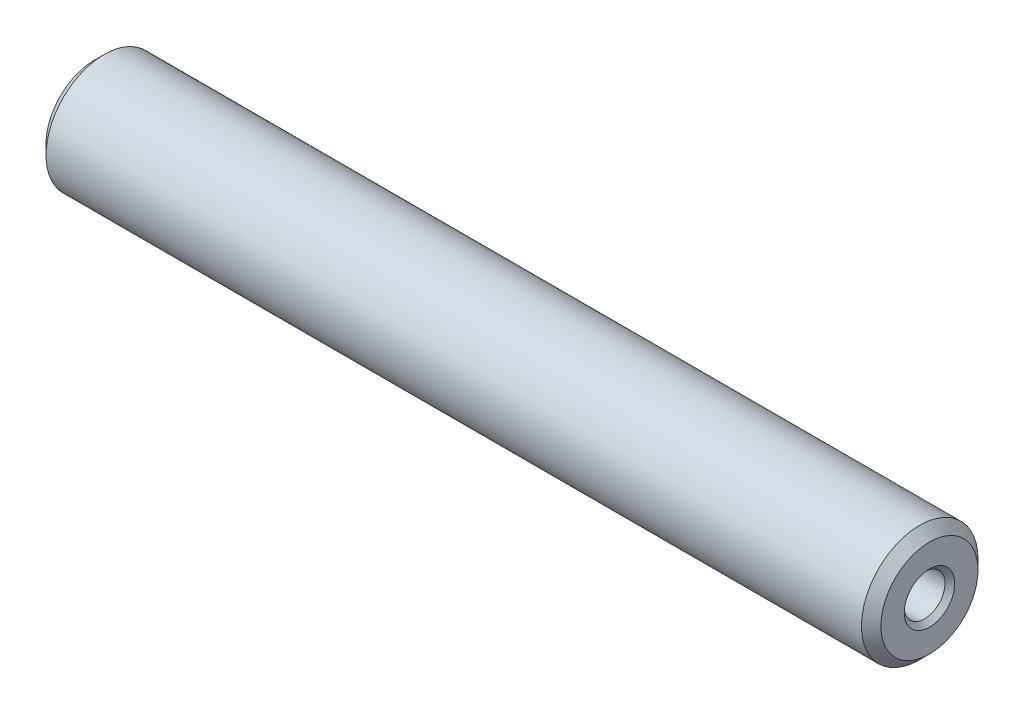
ISO-10303-21;
HEADER;
FILE_DESCRIPTION(('STEP AP214'),'2;1');
FILE_NAME('part.step','',(''),(''),'','','');
FILE_SCHEMA(('AUTOMOTIVE_DESIGN { 1 0 10303 214 1 1 1 1 }'));
ENDSEC;
DATA;
#1=APPLICATION_CONTEXT('core data for automotive mechanical design processes');
#2=APPLICATION_PROTOCOL_DEFINITION('international standard','automotive_design',2000,#1);
#3=PRODUCT_CONTEXT('',#1,'mechanical');
#4=PRODUCT('Part','Part','',(#3));
#5=PRODUCT_RELATED_PRODUCT_CATEGORY('part','',(#4));
#6=PRODUCT_DEFINITION_FORMATION('','',#4);
#7=PRODUCT_DEFINITION_CONTEXT('part definition',#1,'design');
#8=PRODUCT_DEFINITION('design','',#6,#7);
#9=PRODUCT_DEFINITION_SHAPE('','',#8);
#10=(LENGTH_UNIT() NAMED_UNIT(*) SI_UNIT(.MILLI.,.METRE.));
#11=(NAMED_UNIT(*) PLANE_ANGLE_UNIT() SI_UNIT($,.RADIAN.));
#12=(NAMED_UNIT(*) SI_UNIT($,.STERADIAN.) SOLID_ANGLE_UNIT());
#13=UNCERTAINTY_MEASURE_WITH_UNIT(LENGTH_MEASURE(1.E-05),#10,'distance_accuracy_value','');
#14=(GEOMETRIC_REPRESENTATION_CONTEXT(3) GLOBAL_UNCERTAINTY_ASSIGNED_CONTEXT((#13)) GLOBAL_UNIT_ASSIGNED_CONTEXT((#10,
#11,#12)) REPRESENTATION_CONTEXT('',''));
#15=CARTESIAN_POINT('',(0.,0.,0.));
#16=DIRECTION('',(0.,0.,1.));
#17=DIRECTION('',(1.,0.,0.));
#18=AXIS2_PLACEMENT_3D('',#15,#16,#17);
#19=CARTESIAN_POINT('',(86.,0.,0.));
#20=DIRECTION('',(-1.,0.,0.));
#21=DIRECTION('',(0.,0.,1.));
#22=AXIS2_PLACEMENT_3D('',#19,#20,#21);
#23=CYLINDRICAL_SURFACE('',#22,6.);
#24=CARTESIAN_POINT('',(85.,0.,0.));
#25=DIRECTION('',(1.,0.,0.));
#26=DIRECTION('',(0.,0.,-1.));
#27=AXIS2_PLACEMENT_3D('',#24,#25,#26);
#28=CIRCLE('',#27,6.);
#29=CARTESIAN_POINT('',(85.,0.,-6.));
#30=VERTEX_POINT('',#29);
#31=EDGE_CURVE('E72',#30,#30,#28,.F.);
#32=ORIENTED_EDGE('',*,*,#31,.T.);
#33=EDGE_LOOP('',(#32));
#34=FACE_BOUND('',#33,.T.);
#35=CARTESIAN_POINT('',(1.,0.,0.));
#36=DIRECTION('',(1.,0.,0.));
#37=DIRECTION('',(0.,0.,-1.));
#38=AXIS2_PLACEMENT_3D('',#35,#36,#37);
#39=CIRCLE('',#38,6.);
#40=CARTESIAN_POINT('',(1.,0.,-6.));
#41=VERTEX_POINT('',#40);
#42=EDGE_CURVE('E69',#41,#41,#39,.T.);
#43=ORIENTED_EDGE('',*,*,#42,.T.);
#44=EDGE_LOOP('',(#43));
#45=FACE_BOUND('',#44,.T.);
#46=ADVANCED_FACE('F37',(#34,#45),#23,.T.);
#47=CARTESIAN_POINT('',(86.,0.,0.));
#48=DIRECTION('',(1.,0.,0.));
#49=DIRECTION('',(0.,0.,-1.));
#50=AXIS2_PLACEMENT_3D('',#47,#48,#49);
#51=PLANE('',#50);
#52=CARTESIAN_POINT('',(86.,0.,0.));
#53=DIRECTION('',(1.,0.,0.));
#54=DIRECTION('',(0.,0.,-1.));
#55=AXIS2_PLACEMENT_3D('',#52,#53,#54);
#56=CIRCLE('',#55,2.60000000000001);
#57=CARTESIAN_POINT('',(86.,0.,-2.60000000000001));
#58=VERTEX_POINT('',#57);
#59=EDGE_CURVE('E81',#58,#58,#56,.F.);
#60=ORIENTED_EDGE('',*,*,#59,.T.);
#61=EDGE_LOOP('',(#60));
#62=FACE_BOUND('',#61,.T.);
#63=CARTESIAN_POINT('',(86.,0.,0.));
#64=DIRECTION('',(1.,0.,0.));
#65=DIRECTION('',(0.,0.,-1.));
#66=AXIS2_PLACEMENT_3D('',#63,#64,#65);
#67=CIRCLE('',#66,5.00000000000002);
#68=CARTESIAN_POINT('',(86.,0.,-5.00000000000002));
#69=VERTEX_POINT('',#68);
#70=EDGE_CURVE('E64',#69,#69,#67,.T.);
#71=ORIENTED_EDGE('',*,*,#70,.T.);
#72=EDGE_LOOP('',(#71));
#73=FACE_BOUND('',#72,.T.);
#74=ADVANCED_FACE('F95',(#62,#73),#51,.T.);
#75=CARTESIAN_POINT('',(0.,0.,0.));
#76=DIRECTION('',(1.,0.,0.));
#77=DIRECTION('',(0.,0.,-1.));
#78=AXIS2_PLACEMENT_3D('',#75,#76,#77);
#79=PLANE('',#78);
#80=CARTESIAN_POINT('',(0.,0.,0.));
#81=DIRECTION('',(1.,0.,0.));
#82=DIRECTION('',(0.,0.,-1.));
#83=AXIS2_PLACEMENT_3D('',#80,#81,#82);
#84=CIRCLE('',#83,2.6);
#85=CARTESIAN_POINT('',(0.,0.,-2.6));
#86=VERTEX_POINT('',#85);
#87=EDGE_CURVE('E11',#86,#86,#84,.T.);
#88=ORIENTED_EDGE('',*,*,#87,.T.);
#89=EDGE_LOOP('',(#88));
#90=FACE_BOUND('',#89,.T.);
#91=CARTESIAN_POINT('',(0.,0.,0.));
#92=DIRECTION('',(1.,0.,0.));
#93=DIRECTION('',(0.,0.,-1.));
#94=AXIS2_PLACEMENT_3D('',#91,#92,#93);
#95=CIRCLE('',#94,4.99999999999999);
#96=CARTESIAN_POINT('',(0.,0.,-4.99999999999999));
#97=VERTEX_POINT('',#96);
#98=EDGE_CURVE('E75',#97,#97,#95,.F.);
#99=ORIENTED_EDGE('',*,*,#98,.T.);
#100=EDGE_LOOP('',(#99));
#101=FACE_BOUND('',#100,.T.);
#102=ADVANCED_FACE('F101',(#90,#101),#79,.F.);
#103=CARTESIAN_POINT('',(86.,0.,0.));
#104=DIRECTION('',(-1.,0.,0.));
#105=DIRECTION('',(0.,0.,1.));
#106=AXIS2_PLACEMENT_3D('',#103,#104,#105);
#107=CONICAL_SURFACE('',#106,5.00000000000002,0.785398163397446);
#108=ORIENTED_EDGE('',*,*,#31,.F.);
#109=EDGE_LOOP('',(#108));
#110=FACE_BOUND('',#109,.T.);
#111=ORIENTED_EDGE('',*,*,#70,.F.);
#112=EDGE_LOOP('',(#111));
#113=FACE_BOUND('',#112,.T.);
#114=ADVANCED_FACE('F107',(#110,#113),#107,.T.);
#115=CARTESIAN_POINT('',(1.,0.,0.));
#116=DIRECTION('',(1.,0.,0.));
#117=DIRECTION('',(0.,0.,-1.));
#118=AXIS2_PLACEMENT_3D('',#115,#116,#117);
#119=CONICAL_SURFACE('',#118,6.,0.785398163397453);
#120=ORIENTED_EDGE('',*,*,#98,.F.);
#121=EDGE_LOOP('',(#120));
#122=FACE_BOUND('',#121,.T.);
#123=ORIENTED_EDGE('',*,*,#42,.F.);
#124=EDGE_LOOP('',(#123));
#125=FACE_BOUND('',#124,.T.);
#126=ADVANCED_FACE('F110',(#122,#125),#119,.T.);
#127=CARTESIAN_POINT('',(72.,0.,0.));
#128=DIRECTION('',(1.,0.,0.));
#129=DIRECTION('',(0.,0.,-1.));
#130=AXIS2_PLACEMENT_3D('',#127,#128,#129);
#131=CONICAL_SURFACE('',#130,2.09999999999999,1.02974425867665);
#132=CARTESIAN_POINT('',(70.7381927000421,0.,0.));
#133=VERTEX_POINT('',#132);
#134=VERTEX_LOOP('',#133);
#135=FACE_BOUND('',#134,.T.);
#136=CARTESIAN_POINT('',(72.,0.,0.));
#137=DIRECTION('',(1.,0.,0.));
#138=DIRECTION('',(0.,0.,-1.));
#139=AXIS2_PLACEMENT_3D('',#136,#137,#138);
#140=CIRCLE('',#139,2.09999999999999);
#141=CARTESIAN_POINT('',(72.,0.,-2.09999999999999));
#142=VERTEX_POINT('',#141);
#143=EDGE_CURVE('E61',#142,#142,#140,.T.);
#144=ORIENTED_EDGE('',*,*,#143,.T.);
#145=EDGE_LOOP('',(#144));
#146=FACE_BOUND('',#145,.T.);
#147=ADVANCED_FACE('F113',(#135,#146),#131,.F.);
#148=CARTESIAN_POINT('',(86.,0.,0.));
#149=DIRECTION('',(1.,0.,0.));
#150=DIRECTION('',(0.,0.,-1.));
#151=AXIS2_PLACEMENT_3D('',#148,#149,#150);
#152=CYLINDRICAL_SURFACE('',#151,2.09999999999999);
#153=CARTESIAN_POINT('',(85.5,0.,0.));
#154=DIRECTION('',(1.,0.,0.));
#155=DIRECTION('',(0.,0.,-1.));
#156=AXIS2_PLACEMENT_3D('',#153,#154,#155);
#157=CIRCLE('',#156,2.09999999999999);
#158=CARTESIAN_POINT('',(85.5,0.,-2.09999999999999));
#159=VERTEX_POINT('',#158);
#160=EDGE_CURVE('E78',#159,#159,#157,.T.);
#161=ORIENTED_EDGE('',*,*,#160,.T.);
#162=EDGE_LOOP('',(#161));
#163=FACE_BOUND('',#162,.T.);
#164=ORIENTED_EDGE('',*,*,#143,.F.);
#165=EDGE_LOOP('',(#164));
#166=FACE_BOUND('',#165,.T.);
#167=ADVANCED_FACE('F116',(#163,#166),#152,.F.);
#168=CARTESIAN_POINT('',(85.5,0.,0.));
#169=DIRECTION('',(1.,0.,0.));
#170=DIRECTION('',(0.,0.,-1.));
#171=AXIS2_PLACEMENT_3D('',#168,#169,#170);
#172=CONICAL_SURFACE('',#171,2.09999999999999,0.785398163397458);
#173=ORIENTED_EDGE('',*,*,#59,.F.);
#174=EDGE_LOOP('',(#173));
#175=FACE_BOUND('',#174,.T.);
#176=ORIENTED_EDGE('',*,*,#160,.F.);
#177=EDGE_LOOP('',(#176));
#178=FACE_BOUND('',#177,.T.);
#179=ADVANCED_FACE('F55',(#175,#178),#172,.F.);
#180=CARTESIAN_POINT('',(14.,0.,0.));
#181=DIRECTION('',(-1.,0.,0.));
#182=DIRECTION('',(0.,0.,1.));
#183=AXIS2_PLACEMENT_3D('',#180,#181,#182);
#184=CONICAL_SURFACE('',#183,2.09999999999999,1.02974425867665);
#185=CARTESIAN_POINT('',(15.2618072999579,0.,0.));
#186=VERTEX_POINT('',#185);
#187=VERTEX_LOOP('',#186);
#188=FACE_BOUND('',#187,.T.);
#189=CARTESIAN_POINT('',(14.,0.,0.));
#190=DIRECTION('',(-1.,0.,0.));
#191=DIRECTION('',(0.,0.,1.));
#192=AXIS2_PLACEMENT_3D('',#189,#190,#191);
#193=CIRCLE('',#192,2.09999999999999);
#194=CARTESIAN_POINT('',(14.,0.,2.09999999999999));
#195=VERTEX_POINT('',#194);
#196=EDGE_CURVE('E59',#195,#195,#193,.T.);
#197=ORIENTED_EDGE('',*,*,#196,.T.);
#198=EDGE_LOOP('',(#197));
#199=FACE_BOUND('',#198,.T.);
#200=ADVANCED_FACE('F51',(#188,#199),#184,.F.);
#201=CARTESIAN_POINT('',(0.,0.,0.));
#202=DIRECTION('',(-1.,0.,0.));
#203=DIRECTION('',(0.,0.,1.));
#204=AXIS2_PLACEMENT_3D('',#201,#202,#203);
#205=CYLINDRICAL_SURFACE('',#204,2.09999999999999);
#206=CARTESIAN_POINT('',(0.500000000000003,0.,0.));
#207=DIRECTION('',(1.,0.,0.));
#208=DIRECTION('',(0.,0.,-1.));
#209=AXIS2_PLACEMENT_3D('',#206,#207,#208);
#210=CIRCLE('',#209,2.09999999999999);
#211=CARTESIAN_POINT('',(0.500000000000003,0.,-2.09999999999999));
#212=VERTEX_POINT('',#211);
#213=EDGE_CURVE('E45',#212,#212,#210,.F.);
#214=ORIENTED_EDGE('',*,*,#213,.T.);
#215=EDGE_LOOP('',(#214));
#216=FACE_BOUND('',#215,.T.);
#217=ORIENTED_EDGE('',*,*,#196,.F.);
#218=EDGE_LOOP('',(#217));
#219=FACE_BOUND('',#218,.T.);
#220=ADVANCED_FACE('F54',(#216,#219),#205,.F.);
#221=CARTESIAN_POINT('',(0.500000000000003,0.,0.));
#222=DIRECTION('',(-1.,0.,0.));
#223=DIRECTION('',(0.,0.,1.));
#224=AXIS2_PLACEMENT_3D('',#221,#222,#223);
#225=CONICAL_SURFACE('',#224,2.09999999999999,0.785398163397455);
#226=ORIENTED_EDGE('',*,*,#87,.F.);
#227=EDGE_LOOP('',(#226));
#228=FACE_BOUND('',#227,.T.);
#229=ORIENTED_EDGE('',*,*,#213,.F.);
#230=EDGE_LOOP('',(#229));
#231=FACE_BOUND('',#230,.T.);
#232=ADVANCED_FACE('F39',(#228,#231),#225,.F.);
#233=CLOSED_SHELL('',(#46,#74,#102,#114,#126,#147,#167,#179,#200,#220,#232));
#234=MANIFOLD_SOLID_BREP('B2',#233);
#235=ADVANCED_BREP_SHAPE_REPRESENTATION('',(#18,#234),#14);
#236=SHAPE_DEFINITION_REPRESENTATION(#9,#235);
ENDSEC;
END-ISO-10303-21;
